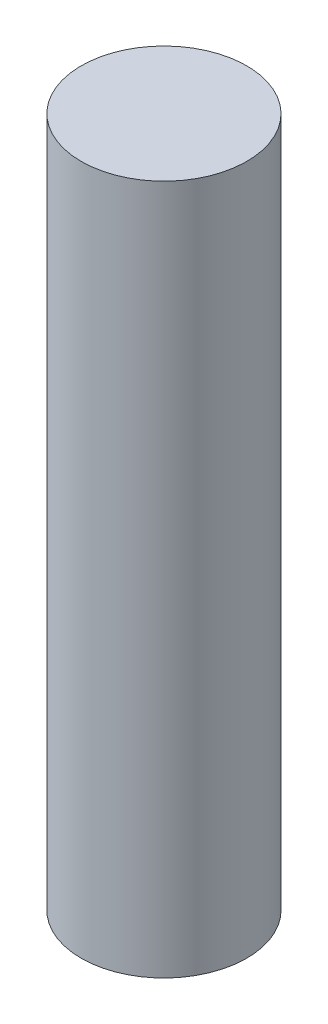
ISO-10303-21;
HEADER;
FILE_DESCRIPTION(('STEP AP214'),'2;1');
FILE_NAME('part.step','',(''),(''),'','','');
FILE_SCHEMA(('AUTOMOTIVE_DESIGN { 1 0 10303 214 1 1 1 1 }'));
ENDSEC;
DATA;
#1=APPLICATION_CONTEXT('core data for automotive mechanical design processes');
#2=APPLICATION_PROTOCOL_DEFINITION('international standard','automotive_design',2000,#1);
#3=PRODUCT_CONTEXT('',#1,'mechanical');
#4=PRODUCT('Part','Part','',(#3));
#5=PRODUCT_RELATED_PRODUCT_CATEGORY('part','',(#4));
#6=PRODUCT_DEFINITION_FORMATION('','',#4);
#7=PRODUCT_DEFINITION_CONTEXT('part definition',#1,'design');
#8=PRODUCT_DEFINITION('design','',#6,#7);
#9=PRODUCT_DEFINITION_SHAPE('','',#8);
#10=(LENGTH_UNIT() NAMED_UNIT(*) SI_UNIT(.MILLI.,.METRE.));
#11=(NAMED_UNIT(*) PLANE_ANGLE_UNIT() SI_UNIT($,.RADIAN.));
#12=(NAMED_UNIT(*) SI_UNIT($,.STERADIAN.) SOLID_ANGLE_UNIT());
#13=UNCERTAINTY_MEASURE_WITH_UNIT(LENGTH_MEASURE(1.E-05),#10,'distance_accuracy_value','');
#14=(GEOMETRIC_REPRESENTATION_CONTEXT(3) GLOBAL_UNCERTAINTY_ASSIGNED_CONTEXT((#13)) GLOBAL_UNIT_ASSIGNED_CONTEXT((#10,
#11,#12)) REPRESENTATION_CONTEXT('',''));
#15=CARTESIAN_POINT('',(0.,0.,0.));
#16=DIRECTION('',(0.,0.,1.));
#17=DIRECTION('',(1.,0.,0.));
#18=AXIS2_PLACEMENT_3D('',#15,#16,#17);
#19=CARTESIAN_POINT('',(0.,150.,0.));
#20=DIRECTION('',(0.,-1.,0.));
#21=DIRECTION('',(0.,0.,-1.));
#22=AXIS2_PLACEMENT_3D('',#19,#20,#21);
#23=CYLINDRICAL_SURFACE('',#22,18.);
#24=CARTESIAN_POINT('',(0.,150.,0.));
#25=DIRECTION('',(0.,1.,0.));
#26=DIRECTION('',(0.,0.,1.));
#27=AXIS2_PLACEMENT_3D('',#24,#25,#26);
#28=CIRCLE('',#27,18.);
#29=CARTESIAN_POINT('',(0.,150.,18.));
#30=VERTEX_POINT('',#29);
#31=EDGE_CURVE('E10',#30,#30,#28,.T.);
#32=ORIENTED_EDGE('',*,*,#31,.F.);
#33=EDGE_LOOP('',(#32));
#34=FACE_BOUND('',#33,.T.);
#35=CARTESIAN_POINT('',(0.,0.,0.));
#36=DIRECTION('',(0.,1.,0.));
#37=DIRECTION('',(0.,0.,1.));
#38=AXIS2_PLACEMENT_3D('',#35,#36,#37);
#39=CIRCLE('',#38,18.);
#40=CARTESIAN_POINT('',(0.,0.,18.));
#41=VERTEX_POINT('',#40);
#42=EDGE_CURVE('E46',#41,#41,#39,.T.);
#43=ORIENTED_EDGE('',*,*,#42,.T.);
#44=EDGE_LOOP('',(#43));
#45=FACE_BOUND('',#44,.T.);
#46=ADVANCED_FACE('F43',(#34,#45),#23,.T.);
#47=CARTESIAN_POINT('',(0.,150.,0.));
#48=DIRECTION('',(0.,1.,0.));
#49=DIRECTION('',(0.,0.,1.));
#50=AXIS2_PLACEMENT_3D('',#47,#48,#49);
#51=PLANE('',#50);
#52=ORIENTED_EDGE('',*,*,#31,.T.);
#53=EDGE_LOOP('',(#52));
#54=FACE_BOUND('',#53,.T.);
#55=ADVANCED_FACE('F60',(#54),#51,.T.);
#56=CARTESIAN_POINT('',(0.,0.,0.));
#57=DIRECTION('',(0.,1.,0.));
#58=DIRECTION('',(0.,0.,1.));
#59=AXIS2_PLACEMENT_3D('',#56,#57,#58);
#60=PLANE('',#59);
#61=ORIENTED_EDGE('',*,*,#42,.F.);
#62=EDGE_LOOP('',(#61));
#63=FACE_BOUND('',#62,.T.);
#64=ADVANCED_FACE('F58',(#63),#60,.F.);
#65=CLOSED_SHELL('',(#46,#55,#64));
#66=MANIFOLD_SOLID_BREP('B2',#65);
#67=ADVANCED_BREP_SHAPE_REPRESENTATION('',(#18,#66),#14);
#68=SHAPE_DEFINITION_REPRESENTATION(#9,#67);
ENDSEC;
END-ISO-10303-21;
